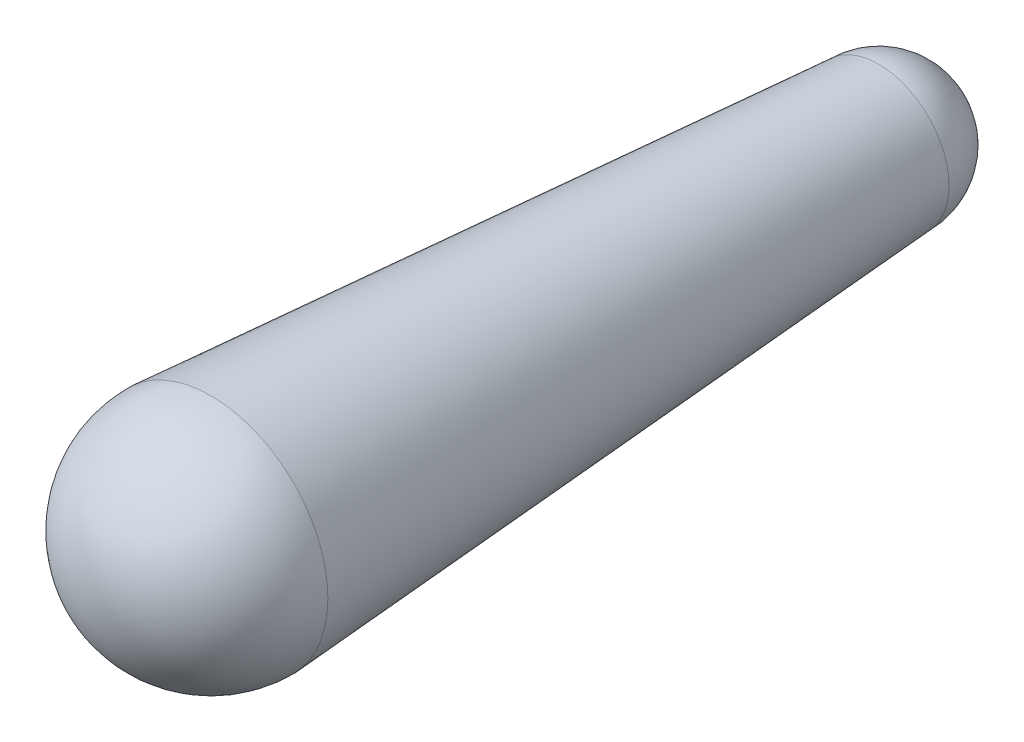
ISO-10303-21;
HEADER;
FILE_DESCRIPTION(('STEP AP214'),'2;1');
FILE_NAME('part.step','',(''),(''),'','','');
FILE_SCHEMA(('AUTOMOTIVE_DESIGN { 1 0 10303 214 1 1 1 1 }'));
ENDSEC;
DATA;
#1=APPLICATION_CONTEXT('core data for automotive mechanical design processes');
#2=APPLICATION_PROTOCOL_DEFINITION('international standard','automotive_design',2000,#1);
#3=PRODUCT_CONTEXT('',#1,'mechanical');
#4=PRODUCT('Part','Part','',(#3));
#5=PRODUCT_RELATED_PRODUCT_CATEGORY('part','',(#4));
#6=PRODUCT_DEFINITION_FORMATION('','',#4);
#7=PRODUCT_DEFINITION_CONTEXT('part definition',#1,'design');
#8=PRODUCT_DEFINITION('design','',#6,#7);
#9=PRODUCT_DEFINITION_SHAPE('','',#8);
#10=(LENGTH_UNIT() NAMED_UNIT(*) SI_UNIT(.MILLI.,.METRE.));
#11=(NAMED_UNIT(*) PLANE_ANGLE_UNIT() SI_UNIT($,.RADIAN.));
#12=(NAMED_UNIT(*) SI_UNIT($,.STERADIAN.) SOLID_ANGLE_UNIT());
#13=UNCERTAINTY_MEASURE_WITH_UNIT(LENGTH_MEASURE(1.E-05),#10,'distance_accuracy_value','');
#14=(GEOMETRIC_REPRESENTATION_CONTEXT(3) GLOBAL_UNCERTAINTY_ASSIGNED_CONTEXT((#13)) GLOBAL_UNIT_ASSIGNED_CONTEXT((#10,
#11,#12)) REPRESENTATION_CONTEXT('',''));
#15=CARTESIAN_POINT('',(0.,0.,0.));
#16=DIRECTION('',(0.,0.,1.));
#17=DIRECTION('',(1.,0.,0.));
#18=AXIS2_PLACEMENT_3D('',#15,#16,#17);
#19=CARTESIAN_POINT('',(0.,0.,0.));
#20=DIRECTION('',(0.,0.,1.));
#21=DIRECTION('',(1.,0.,0.));
#22=AXIS2_PLACEMENT_3D('',#19,#20,#21);
#23=CONICAL_SURFACE('',#22,44.45,0.0698131700797733);
#24=CARTESIAN_POINT('',(0.,0.,-254.));
#25=DIRECTION('',(0.,0.,1.));
#26=DIRECTION('',(1.,0.,0.));
#27=AXIS2_PLACEMENT_3D('',#24,#25,#26);
#28=CIRCLE('',#27,26.6885897663483);
#29=CARTESIAN_POINT('',(26.6885897663483,0.,-254.));
#30=VERTEX_POINT('',#29);
#31=EDGE_CURVE('E36',#30,#30,#28,.F.);
#32=ORIENTED_EDGE('',*,*,#31,.F.);
#33=EDGE_LOOP('',(#32));
#34=FACE_BOUND('',#33,.T.);
#35=CARTESIAN_POINT('',(0.,0.,0.));
#36=DIRECTION('',(0.,0.,1.));
#37=DIRECTION('',(1.,0.,0.));
#38=AXIS2_PLACEMENT_3D('',#35,#36,#37);
#39=CIRCLE('',#38,44.45);
#40=CARTESIAN_POINT('',(44.45,0.,0.));
#41=VERTEX_POINT('',#40);
#42=EDGE_CURVE('E10',#41,#41,#39,.T.);
#43=ORIENTED_EDGE('',*,*,#42,.F.);
#44=EDGE_LOOP('',(#43));
#45=FACE_BOUND('',#44,.T.);
#46=ADVANCED_FACE('F30',(#34,#45),#23,.T.);
#47=CARTESIAN_POINT('',(0.,0.,0.));
#48=DIRECTION('',(0.,1.,0.));
#49=DIRECTION('',(1.,0.,0.));
#50=AXIS2_PLACEMENT_3D('',#47,#48,#49);
#51=SPHERICAL_SURFACE('',#50,44.45);
#52=CARTESIAN_POINT('',(0.,0.,0.));
#53=DIRECTION('',(0.,0.,1.));
#54=DIRECTION('',(1.,0.,0.));
#55=AXIS2_PLACEMENT_3D('',#52,#53,#54);
#56=SPHERICAL_SURFACE('',#55,44.45);
#57=ORIENTED_EDGE('',*,*,#42,.T.);
#58=EDGE_LOOP('',(#57));
#59=FACE_BOUND('',#58,.T.);
#60=ADVANCED_FACE('F46',(#59),#56,.T.);
#61=CARTESIAN_POINT('',(0.,0.,-254.));
#62=DIRECTION('',(0.,1.,0.));
#63=DIRECTION('',(0.,0.,-1.));
#64=AXIS2_PLACEMENT_3D('',#61,#62,#63);
#65=SPHERICAL_SURFACE('',#64,26.6885897663483);
#66=CARTESIAN_POINT('',(0.,0.,-254.));
#67=DIRECTION('',(0.,0.,1.));
#68=DIRECTION('',(1.,0.,0.));
#69=AXIS2_PLACEMENT_3D('',#66,#67,#68);
#70=SPHERICAL_SURFACE('',#69,26.6885897663483);
#71=ORIENTED_EDGE('',*,*,#31,.T.);
#72=EDGE_LOOP('',(#71));
#73=FACE_BOUND('',#72,.T.);
#74=ADVANCED_FACE('F42',(#73),#70,.T.);
#75=CLOSED_SHELL('',(#46,#60,#74));
#76=MANIFOLD_SOLID_BREP('B2',#75);
#77=ADVANCED_BREP_SHAPE_REPRESENTATION('',(#18,#76),#14);
#78=SHAPE_DEFINITION_REPRESENTATION(#9,#77);
ENDSEC;
END-ISO-10303-21;
